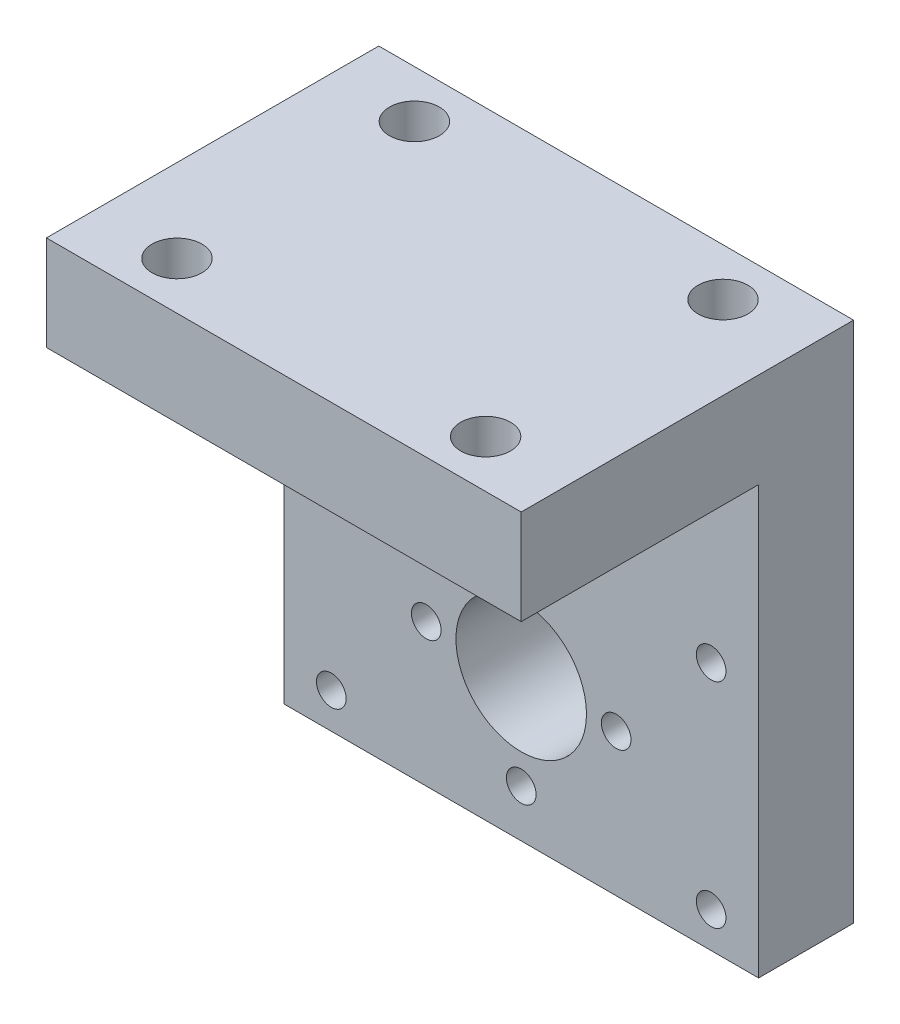
ISO-10303-21;
HEADER;
FILE_DESCRIPTION(('STEP AP214'),'2;1');
FILE_NAME('part.step','',(''),(''),'','','');
FILE_SCHEMA(('AUTOMOTIVE_DESIGN { 1 0 10303 214 1 1 1 1 }'));
ENDSEC;
DATA;
#1=APPLICATION_CONTEXT('core data for automotive mechanical design processes');
#2=APPLICATION_PROTOCOL_DEFINITION('international standard','automotive_design',2000,#1);
#3=PRODUCT_CONTEXT('',#1,'mechanical');
#4=PRODUCT('Part','Part','',(#3));
#5=PRODUCT_RELATED_PRODUCT_CATEGORY('part','',(#4));
#6=PRODUCT_DEFINITION_FORMATION('','',#4);
#7=PRODUCT_DEFINITION_CONTEXT('part definition',#1,'design');
#8=PRODUCT_DEFINITION('design','',#6,#7);
#9=PRODUCT_DEFINITION_SHAPE('','',#8);
#10=(LENGTH_UNIT() NAMED_UNIT(*) SI_UNIT(.MILLI.,.METRE.));
#11=(NAMED_UNIT(*) PLANE_ANGLE_UNIT() SI_UNIT($,.RADIAN.));
#12=(NAMED_UNIT(*) SI_UNIT($,.STERADIAN.) SOLID_ANGLE_UNIT());
#13=UNCERTAINTY_MEASURE_WITH_UNIT(LENGTH_MEASURE(1.E-05),#10,'distance_accuracy_value','');
#14=(GEOMETRIC_REPRESENTATION_CONTEXT(3) GLOBAL_UNCERTAINTY_ASSIGNED_CONTEXT((#13)) GLOBAL_UNIT_ASSIGNED_CONTEXT((#10,
#11,#12)) REPRESENTATION_CONTEXT('',''));
#15=CARTESIAN_POINT('',(0.,0.,0.));
#16=DIRECTION('',(0.,0.,1.));
#17=DIRECTION('',(1.,0.,0.));
#18=AXIS2_PLACEMENT_3D('',#15,#16,#17);
#19=CARTESIAN_POINT('',(13.,21.,4.));
#20=DIRECTION('',(0.,1.,0.));
#21=DIRECTION('',(1.,0.,0.));
#22=AXIS2_PLACEMENT_3D('',#19,#20,#21);
#23=PLANE('',#22);
#24=CARTESIAN_POINT('',(13.,21.,4.));
#25=DIRECTION('',(0.,1.,0.));
#26=DIRECTION('',(0.,0.,1.));
#27=AXIS2_PLACEMENT_3D('',#24,#25,#26);
#28=CIRCLE('',#27,2.1);
#29=CARTESIAN_POINT('',(13.,21.,6.1));
#30=VERTEX_POINT('',#29);
#31=EDGE_CURVE('E10',#30,#30,#28,.T.);
#32=ORIENTED_EDGE('',*,*,#31,.T.);
#33=EDGE_LOOP('',(#32));
#34=FACE_BOUND('',#33,.T.);
#35=ADVANCED_FACE('F16',(#34),#23,.T.);
#36=CARTESIAN_POINT('',(-13.,21.,4.));
#37=DIRECTION('',(0.,1.,0.));
#38=DIRECTION('',(1.,0.,0.));
#39=AXIS2_PLACEMENT_3D('',#36,#37,#38);
#40=PLANE('',#39);
#41=CARTESIAN_POINT('',(-13.,21.,4.));
#42=DIRECTION('',(0.,1.,0.));
#43=DIRECTION('',(0.,0.,1.));
#44=AXIS2_PLACEMENT_3D('',#41,#42,#43);
#45=CIRCLE('',#44,2.1);
#46=CARTESIAN_POINT('',(-13.,21.,6.1));
#47=VERTEX_POINT('',#46);
#48=EDGE_CURVE('E25',#47,#47,#45,.T.);
#49=ORIENTED_EDGE('',*,*,#48,.T.);
#50=EDGE_LOOP('',(#49));
#51=FACE_BOUND('',#50,.T.);
#52=ADVANCED_FACE('F291',(#51),#40,.T.);
#53=CARTESIAN_POINT('',(13.,21.,24.));
#54=DIRECTION('',(0.,1.,0.));
#55=DIRECTION('',(0.,0.,1.));
#56=AXIS2_PLACEMENT_3D('',#53,#54,#55);
#57=CYLINDRICAL_SURFACE('',#56,2.1);
#58=CARTESIAN_POINT('',(13.,32.,24.));
#59=DIRECTION('',(0.,1.,0.));
#60=DIRECTION('',(0.,0.,1.));
#61=AXIS2_PLACEMENT_3D('',#58,#59,#60);
#62=CIRCLE('',#61,2.1);
#63=CARTESIAN_POINT('',(13.,32.,26.1));
#64=VERTEX_POINT('',#63);
#65=EDGE_CURVE('E236',#64,#64,#62,.T.);
#66=ORIENTED_EDGE('',*,*,#65,.T.);
#67=EDGE_LOOP('',(#66));
#68=FACE_BOUND('',#67,.T.);
#69=CARTESIAN_POINT('',(13.,24.,24.));
#70=DIRECTION('',(0.,1.,0.));
#71=DIRECTION('',(0.,0.,1.));
#72=AXIS2_PLACEMENT_3D('',#69,#70,#71);
#73=CIRCLE('',#72,2.1);
#74=CARTESIAN_POINT('',(13.,24.,26.1));
#75=VERTEX_POINT('',#74);
#76=EDGE_CURVE('E124',#75,#75,#73,.T.);
#77=ORIENTED_EDGE('',*,*,#76,.F.);
#78=EDGE_LOOP('',(#77));
#79=FACE_BOUND('',#78,.T.);
#80=ADVANCED_FACE('F296',(#68,#79),#57,.F.);
#81=CARTESIAN_POINT('',(13.,21.,4.));
#82=DIRECTION('',(0.,1.,0.));
#83=DIRECTION('',(0.,0.,1.));
#84=AXIS2_PLACEMENT_3D('',#81,#82,#83);
#85=CYLINDRICAL_SURFACE('',#84,2.1);
#86=CARTESIAN_POINT('',(13.,32.,4.));
#87=DIRECTION('',(0.,1.,0.));
#88=DIRECTION('',(0.,0.,1.));
#89=AXIS2_PLACEMENT_3D('',#86,#87,#88);
#90=CIRCLE('',#89,2.1);
#91=CARTESIAN_POINT('',(13.,32.,6.1));
#92=VERTEX_POINT('',#91);
#93=EDGE_CURVE('E232',#92,#92,#90,.T.);
#94=ORIENTED_EDGE('',*,*,#93,.T.);
#95=EDGE_LOOP('',(#94));
#96=FACE_BOUND('',#95,.T.);
#97=ORIENTED_EDGE('',*,*,#31,.F.);
#98=EDGE_LOOP('',(#97));
#99=FACE_BOUND('',#98,.T.);
#100=ADVANCED_FACE('F301',(#96,#99),#85,.F.);
#101=CARTESIAN_POINT('',(-13.,21.,24.));
#102=DIRECTION('',(0.,1.,0.));
#103=DIRECTION('',(0.,0.,1.));
#104=AXIS2_PLACEMENT_3D('',#101,#102,#103);
#105=CYLINDRICAL_SURFACE('',#104,2.1);
#106=CARTESIAN_POINT('',(-13.,32.,24.));
#107=DIRECTION('',(0.,1.,0.));
#108=DIRECTION('',(0.,0.,1.));
#109=AXIS2_PLACEMENT_3D('',#106,#107,#108);
#110=CIRCLE('',#109,2.1);
#111=CARTESIAN_POINT('',(-13.,32.,26.1));
#112=VERTEX_POINT('',#111);
#113=EDGE_CURVE('E228',#112,#112,#110,.T.);
#114=ORIENTED_EDGE('',*,*,#113,.T.);
#115=EDGE_LOOP('',(#114));
#116=FACE_BOUND('',#115,.T.);
#117=CARTESIAN_POINT('',(-13.,24.,24.));
#118=DIRECTION('',(0.,1.,0.));
#119=DIRECTION('',(0.,0.,1.));
#120=AXIS2_PLACEMENT_3D('',#117,#118,#119);
#121=CIRCLE('',#120,2.1);
#122=CARTESIAN_POINT('',(-13.,24.,26.1));
#123=VERTEX_POINT('',#122);
#124=EDGE_CURVE('E128',#123,#123,#121,.T.);
#125=ORIENTED_EDGE('',*,*,#124,.F.);
#126=EDGE_LOOP('',(#125));
#127=FACE_BOUND('',#126,.T.);
#128=ADVANCED_FACE('F303',(#116,#127),#105,.F.);
#129=CARTESIAN_POINT('',(-13.,21.,4.));
#130=DIRECTION('',(0.,1.,0.));
#131=DIRECTION('',(0.,0.,1.));
#132=AXIS2_PLACEMENT_3D('',#129,#130,#131);
#133=CYLINDRICAL_SURFACE('',#132,2.1);
#134=CARTESIAN_POINT('',(-13.,32.,4.));
#135=DIRECTION('',(0.,1.,0.));
#136=DIRECTION('',(0.,0.,1.));
#137=AXIS2_PLACEMENT_3D('',#134,#135,#136);
#138=CIRCLE('',#137,2.1);
#139=CARTESIAN_POINT('',(-13.,32.,6.1));
#140=VERTEX_POINT('',#139);
#141=EDGE_CURVE('E224',#140,#140,#138,.T.);
#142=ORIENTED_EDGE('',*,*,#141,.T.);
#143=EDGE_LOOP('',(#142));
#144=FACE_BOUND('',#143,.T.);
#145=ORIENTED_EDGE('',*,*,#48,.F.);
#146=EDGE_LOOP('',(#145));
#147=FACE_BOUND('',#146,.T.);
#148=ADVANCED_FACE('F310',(#144,#147),#133,.F.);
#149=CARTESIAN_POINT('',(16.,9.,-1.));
#150=DIRECTION('',(0.,0.,1.));
#151=DIRECTION('',(1.,0.,0.));
#152=AXIS2_PLACEMENT_3D('',#149,#150,#151);
#153=CYLINDRICAL_SURFACE('',#152,1.25);
#154=CARTESIAN_POINT('',(16.,9.,8.));
#155=DIRECTION('',(0.,0.,1.));
#156=DIRECTION('',(1.,0.,0.));
#157=AXIS2_PLACEMENT_3D('',#154,#155,#156);
#158=CIRCLE('',#157,1.25);
#159=CARTESIAN_POINT('',(17.25,9.,8.));
#160=VERTEX_POINT('',#159);
#161=EDGE_CURVE('E173',#160,#160,#158,.T.);
#162=ORIENTED_EDGE('',*,*,#161,.T.);
#163=EDGE_LOOP('',(#162));
#164=FACE_BOUND('',#163,.T.);
#165=CARTESIAN_POINT('',(16.,9.,0.));
#166=DIRECTION('',(0.,0.,1.));
#167=DIRECTION('',(1.,0.,0.));
#168=AXIS2_PLACEMENT_3D('',#165,#166,#167);
#169=CIRCLE('',#168,1.25);
#170=CARTESIAN_POINT('',(17.25,9.,0.));
#171=VERTEX_POINT('',#170);
#172=EDGE_CURVE('E93',#171,#171,#169,.T.);
#173=ORIENTED_EDGE('',*,*,#172,.F.);
#174=EDGE_LOOP('',(#173));
#175=FACE_BOUND('',#174,.T.);
#176=ADVANCED_FACE('F317',(#164,#175),#153,.F.);
#177=CARTESIAN_POINT('',(0.,8.,-1.));
#178=DIRECTION('',(0.,0.,1.));
#179=DIRECTION('',(1.,0.,0.));
#180=AXIS2_PLACEMENT_3D('',#177,#178,#179);
#181=CYLINDRICAL_SURFACE('',#180,1.25);
#182=CARTESIAN_POINT('',(0.,8.,8.));
#183=DIRECTION('',(0.,0.,1.));
#184=DIRECTION('',(1.,0.,0.));
#185=AXIS2_PLACEMENT_3D('',#182,#183,#184);
#186=CIRCLE('',#185,1.25);
#187=CARTESIAN_POINT('',(1.25,8.,8.));
#188=VERTEX_POINT('',#187);
#189=EDGE_CURVE('E153',#188,#188,#186,.T.);
#190=ORIENTED_EDGE('',*,*,#189,.T.);
#191=EDGE_LOOP('',(#190));
#192=FACE_BOUND('',#191,.T.);
#193=CARTESIAN_POINT('',(0.,8.,0.));
#194=DIRECTION('',(0.,0.,1.));
#195=DIRECTION('',(1.,0.,0.));
#196=AXIS2_PLACEMENT_3D('',#193,#194,#195);
#197=CIRCLE('',#196,1.25);
#198=CARTESIAN_POINT('',(1.25,8.,0.));
#199=VERTEX_POINT('',#198);
#200=EDGE_CURVE('E165',#199,#199,#197,.T.);
#201=ORIENTED_EDGE('',*,*,#200,.F.);
#202=EDGE_LOOP('',(#201));
#203=FACE_BOUND('',#202,.T.);
#204=ADVANCED_FACE('F321',(#192,#203),#181,.F.);
#205=CARTESIAN_POINT('',(8.,0.,-1.));
#206=DIRECTION('',(0.,0.,1.));
#207=DIRECTION('',(1.,0.,0.));
#208=AXIS2_PLACEMENT_3D('',#205,#206,#207);
#209=CYLINDRICAL_SURFACE('',#208,1.25);
#210=CARTESIAN_POINT('',(8.,0.,8.));
#211=DIRECTION('',(0.,0.,1.));
#212=DIRECTION('',(1.,0.,0.));
#213=AXIS2_PLACEMENT_3D('',#210,#211,#212);
#214=CIRCLE('',#213,1.25);
#215=CARTESIAN_POINT('',(9.25,0.,8.));
#216=VERTEX_POINT('',#215);
#217=EDGE_CURVE('E149',#216,#216,#214,.T.);
#218=ORIENTED_EDGE('',*,*,#217,.T.);
#219=EDGE_LOOP('',(#218));
#220=FACE_BOUND('',#219,.T.);
#221=CARTESIAN_POINT('',(8.,0.,0.));
#222=DIRECTION('',(0.,0.,1.));
#223=DIRECTION('',(1.,0.,0.));
#224=AXIS2_PLACEMENT_3D('',#221,#222,#223);
#225=CIRCLE('',#224,1.25);
#226=CARTESIAN_POINT('',(9.25,0.,0.));
#227=VERTEX_POINT('',#226);
#228=EDGE_CURVE('E169',#227,#227,#225,.T.);
#229=ORIENTED_EDGE('',*,*,#228,.F.);
#230=EDGE_LOOP('',(#229));
#231=FACE_BOUND('',#230,.T.);
#232=ADVANCED_FACE('F362',(#220,#231),#209,.F.);
#233=CARTESIAN_POINT('',(0.,0.,-1.));
#234=DIRECTION('',(0.,0.,1.));
#235=DIRECTION('',(1.,0.,0.));
#236=AXIS2_PLACEMENT_3D('',#233,#234,#235);
#237=CYLINDRICAL_SURFACE('',#236,5.5);
#238=CARTESIAN_POINT('',(0.,0.,8.));
#239=DIRECTION('',(0.,0.,1.));
#240=DIRECTION('',(1.,0.,0.));
#241=AXIS2_PLACEMENT_3D('',#238,#239,#240);
#242=CIRCLE('',#241,5.5);
#243=CARTESIAN_POINT('',(5.5,0.,8.));
#244=VERTEX_POINT('',#243);
#245=EDGE_CURVE('E154',#244,#244,#242,.T.);
#246=ORIENTED_EDGE('',*,*,#245,.T.);
#247=EDGE_LOOP('',(#246));
#248=FACE_BOUND('',#247,.T.);
#249=CARTESIAN_POINT('',(0.,0.,0.));
#250=DIRECTION('',(0.,0.,1.));
#251=DIRECTION('',(1.,0.,0.));
#252=AXIS2_PLACEMENT_3D('',#249,#250,#251);
#253=CIRCLE('',#252,5.5);
#254=CARTESIAN_POINT('',(5.5,0.,0.));
#255=VERTEX_POINT('',#254);
#256=EDGE_CURVE('E212',#255,#255,#253,.T.);
#257=ORIENTED_EDGE('',*,*,#256,.F.);
#258=EDGE_LOOP('',(#257));
#259=FACE_BOUND('',#258,.T.);
#260=ADVANCED_FACE('F327',(#248,#259),#237,.F.);
#261=CARTESIAN_POINT('',(-16.,9.,-1.));
#262=DIRECTION('',(0.,0.,1.));
#263=DIRECTION('',(1.,0.,0.));
#264=AXIS2_PLACEMENT_3D('',#261,#262,#263);
#265=CYLINDRICAL_SURFACE('',#264,1.25);
#266=CARTESIAN_POINT('',(-16.,9.,8.));
#267=DIRECTION('',(0.,0.,1.));
#268=DIRECTION('',(1.,0.,0.));
#269=AXIS2_PLACEMENT_3D('',#266,#267,#268);
#270=CIRCLE('',#269,1.25);
#271=CARTESIAN_POINT('',(-14.75,9.,8.));
#272=VERTEX_POINT('',#271);
#273=EDGE_CURVE('E140',#272,#272,#270,.T.);
#274=ORIENTED_EDGE('',*,*,#273,.T.);
#275=EDGE_LOOP('',(#274));
#276=FACE_BOUND('',#275,.T.);
#277=CARTESIAN_POINT('',(-16.,9.,0.));
#278=DIRECTION('',(0.,0.,1.));
#279=DIRECTION('',(1.,0.,0.));
#280=AXIS2_PLACEMENT_3D('',#277,#278,#279);
#281=CIRCLE('',#280,1.25);
#282=CARTESIAN_POINT('',(-14.75,9.,0.));
#283=VERTEX_POINT('',#282);
#284=EDGE_CURVE('E208',#283,#283,#281,.T.);
#285=ORIENTED_EDGE('',*,*,#284,.F.);
#286=EDGE_LOOP('',(#285));
#287=FACE_BOUND('',#286,.T.);
#288=ADVANCED_FACE('F323',(#276,#287),#265,.F.);
#289=CARTESIAN_POINT('',(-8.,0.,-1.));
#290=DIRECTION('',(0.,0.,1.));
#291=DIRECTION('',(1.,0.,0.));
#292=AXIS2_PLACEMENT_3D('',#289,#290,#291);
#293=CYLINDRICAL_SURFACE('',#292,1.25);
#294=CARTESIAN_POINT('',(-8.,0.,8.));
#295=DIRECTION('',(0.,0.,1.));
#296=DIRECTION('',(1.,0.,0.));
#297=AXIS2_PLACEMENT_3D('',#294,#295,#296);
#298=CIRCLE('',#297,1.25);
#299=CARTESIAN_POINT('',(-6.75,0.,8.));
#300=VERTEX_POINT('',#299);
#301=EDGE_CURVE('E136',#300,#300,#298,.T.);
#302=ORIENTED_EDGE('',*,*,#301,.T.);
#303=EDGE_LOOP('',(#302));
#304=FACE_BOUND('',#303,.T.);
#305=CARTESIAN_POINT('',(-8.,0.,0.));
#306=DIRECTION('',(0.,0.,1.));
#307=DIRECTION('',(1.,0.,0.));
#308=AXIS2_PLACEMENT_3D('',#305,#306,#307);
#309=CIRCLE('',#308,1.25);
#310=CARTESIAN_POINT('',(-6.75,0.,0.));
#311=VERTEX_POINT('',#310);
#312=EDGE_CURVE('E204',#311,#311,#309,.T.);
#313=ORIENTED_EDGE('',*,*,#312,.F.);
#314=EDGE_LOOP('',(#313));
#315=FACE_BOUND('',#314,.T.);
#316=ADVANCED_FACE('F326',(#304,#315),#293,.F.);
#317=CARTESIAN_POINT('',(16.,-9.,-1.));
#318=DIRECTION('',(0.,0.,1.));
#319=DIRECTION('',(1.,0.,0.));
#320=AXIS2_PLACEMENT_3D('',#317,#318,#319);
#321=CYLINDRICAL_SURFACE('',#320,1.25);
#322=CARTESIAN_POINT('',(16.,-9.,8.));
#323=DIRECTION('',(0.,0.,1.));
#324=DIRECTION('',(1.,0.,0.));
#325=AXIS2_PLACEMENT_3D('',#322,#323,#324);
#326=CIRCLE('',#325,1.25);
#327=CARTESIAN_POINT('',(17.25,-9.,8.));
#328=VERTEX_POINT('',#327);
#329=EDGE_CURVE('E141',#328,#328,#326,.T.);
#330=ORIENTED_EDGE('',*,*,#329,.T.);
#331=EDGE_LOOP('',(#330));
#332=FACE_BOUND('',#331,.T.);
#333=CARTESIAN_POINT('',(16.,-9.,0.));
#334=DIRECTION('',(0.,0.,1.));
#335=DIRECTION('',(1.,0.,0.));
#336=AXIS2_PLACEMENT_3D('',#333,#334,#335);
#337=CIRCLE('',#336,1.25);
#338=CARTESIAN_POINT('',(17.25,-9.,0.));
#339=VERTEX_POINT('',#338);
#340=EDGE_CURVE('E200',#339,#339,#337,.T.);
#341=ORIENTED_EDGE('',*,*,#340,.F.);
#342=EDGE_LOOP('',(#341));
#343=FACE_BOUND('',#342,.T.);
#344=ADVANCED_FACE('F329',(#332,#343),#321,.F.);
#345=CARTESIAN_POINT('',(0.,-8.,-1.));
#346=DIRECTION('',(0.,0.,1.));
#347=DIRECTION('',(1.,0.,0.));
#348=AXIS2_PLACEMENT_3D('',#345,#346,#347);
#349=CYLINDRICAL_SURFACE('',#348,1.25);
#350=CARTESIAN_POINT('',(0.,-8.,8.));
#351=DIRECTION('',(0.,0.,1.));
#352=DIRECTION('',(1.,0.,0.));
#353=AXIS2_PLACEMENT_3D('',#350,#351,#352);
#354=CIRCLE('',#353,1.25);
#355=CARTESIAN_POINT('',(1.25,-8.,8.));
#356=VERTEX_POINT('',#355);
#357=EDGE_CURVE('E155',#356,#356,#354,.T.);
#358=ORIENTED_EDGE('',*,*,#357,.T.);
#359=EDGE_LOOP('',(#358));
#360=FACE_BOUND('',#359,.T.);
#361=CARTESIAN_POINT('',(0.,-8.,0.));
#362=DIRECTION('',(0.,0.,1.));
#363=DIRECTION('',(1.,0.,0.));
#364=AXIS2_PLACEMENT_3D('',#361,#362,#363);
#365=CIRCLE('',#364,1.25);
#366=CARTESIAN_POINT('',(1.25,-8.,0.));
#367=VERTEX_POINT('',#366);
#368=EDGE_CURVE('E196',#367,#367,#365,.T.);
#369=ORIENTED_EDGE('',*,*,#368,.F.);
#370=EDGE_LOOP('',(#369));
#371=FACE_BOUND('',#370,.T.);
#372=ADVANCED_FACE('F331',(#360,#371),#349,.F.);
#373=CARTESIAN_POINT('',(-16.,-9.,-1.));
#374=DIRECTION('',(0.,0.,1.));
#375=DIRECTION('',(1.,0.,0.));
#376=AXIS2_PLACEMENT_3D('',#373,#374,#375);
#377=CYLINDRICAL_SURFACE('',#376,1.25);
#378=CARTESIAN_POINT('',(-16.,-9.,8.));
#379=DIRECTION('',(0.,0.,1.));
#380=DIRECTION('',(1.,0.,0.));
#381=AXIS2_PLACEMENT_3D('',#378,#379,#380);
#382=CIRCLE('',#381,1.25);
#383=CARTESIAN_POINT('',(-14.75,-9.,8.));
#384=VERTEX_POINT('',#383);
#385=EDGE_CURVE('E148',#384,#384,#382,.T.);
#386=ORIENTED_EDGE('',*,*,#385,.T.);
#387=EDGE_LOOP('',(#386));
#388=FACE_BOUND('',#387,.T.);
#389=CARTESIAN_POINT('',(-16.,-9.,0.));
#390=DIRECTION('',(0.,0.,1.));
#391=DIRECTION('',(1.,0.,0.));
#392=AXIS2_PLACEMENT_3D('',#389,#390,#391);
#393=CIRCLE('',#392,1.25);
#394=CARTESIAN_POINT('',(-14.75,-9.,0.));
#395=VERTEX_POINT('',#394);
#396=EDGE_CURVE('E192',#395,#395,#393,.T.);
#397=ORIENTED_EDGE('',*,*,#396,.F.);
#398=EDGE_LOOP('',(#397));
#399=FACE_BOUND('',#398,.T.);
#400=ADVANCED_FACE('F260',(#388,#399),#377,.F.);
#401=CARTESIAN_POINT('',(20.,-12.,0.));
#402=DIRECTION('',(1.,0.,0.));
#403=DIRECTION('',(0.,1.,0.));
#404=AXIS2_PLACEMENT_3D('',#401,#402,#403);
#405=PLANE('',#404);
#406=DIRECTION('',(0.,1.,0.));
#407=VECTOR('',#406,1.);
#408=CARTESIAN_POINT('',(20.,-12.,8.));
#409=LINE('',#408,#407);
#410=CARTESIAN_POINT('',(20.,-12.,8.));
#411=VERTEX_POINT('',#410);
#412=CARTESIAN_POINT('',(20.,24.,8.));
#413=VERTEX_POINT('',#412);
#414=EDGE_CURVE('E135',#411,#413,#409,.T.);
#415=ORIENTED_EDGE('',*,*,#414,.F.);
#416=DIRECTION('',(0.,0.,1.));
#417=VECTOR('',#416,1.);
#418=CARTESIAN_POINT('',(20.,-12.,0.));
#419=LINE('',#418,#417);
#420=CARTESIAN_POINT('',(20.,-12.,0.));
#421=VERTEX_POINT('',#420);
#422=EDGE_CURVE('E177',#421,#411,#419,.T.);
#423=ORIENTED_EDGE('',*,*,#422,.F.);
#424=DIRECTION('',(0.,-1.,0.));
#425=VECTOR('',#424,1.);
#426=CARTESIAN_POINT('',(20.,32.,0.));
#427=LINE('',#426,#425);
#428=CARTESIAN_POINT('',(20.,32.,0.));
#429=VERTEX_POINT('',#428);
#430=EDGE_CURVE('E189',#429,#421,#427,.T.);
#431=ORIENTED_EDGE('',*,*,#430,.F.);
#432=DIRECTION('',(0.,0.,1.));
#433=VECTOR('',#432,1.);
#434=CARTESIAN_POINT('',(20.,32.,0.));
#435=LINE('',#434,#433);
#436=CARTESIAN_POINT('',(20.,32.,28.));
#437=VERTEX_POINT('',#436);
#438=EDGE_CURVE('E92',#429,#437,#435,.T.);
#439=ORIENTED_EDGE('',*,*,#438,.T.);
#440=DIRECTION('',(0.,1.,0.));
#441=VECTOR('',#440,1.);
#442=CARTESIAN_POINT('',(20.,24.,28.));
#443=LINE('',#442,#441);
#444=CARTESIAN_POINT('',(20.,24.,28.));
#445=VERTEX_POINT('',#444);
#446=EDGE_CURVE('E88',#445,#437,#443,.T.);
#447=ORIENTED_EDGE('',*,*,#446,.F.);
#448=DIRECTION('',(0.,0.,1.));
#449=VECTOR('',#448,1.);
#450=CARTESIAN_POINT('',(20.,24.,0.));
#451=LINE('',#450,#449);
#452=EDGE_CURVE('E36',#413,#445,#451,.T.);
#453=ORIENTED_EDGE('',*,*,#452,.F.);
#454=EDGE_LOOP('',(#415,#423,#431,#439,#447,#453));
#455=FACE_BOUND('',#454,.T.);
#456=ADVANCED_FACE('F276',(#455),#405,.T.);
#457=CARTESIAN_POINT('',(-20.,24.,0.));
#458=DIRECTION('',(0.,1.,0.));
#459=DIRECTION('',(1.,0.,0.));
#460=AXIS2_PLACEMENT_3D('',#457,#458,#459);
#461=PLANE('',#460);
#462=ORIENTED_EDGE('',*,*,#76,.T.);
#463=EDGE_LOOP('',(#462));
#464=FACE_BOUND('',#463,.T.);
#465=ORIENTED_EDGE('',*,*,#124,.T.);
#466=EDGE_LOOP('',(#465));
#467=FACE_BOUND('',#466,.T.);
#468=DIRECTION('',(1.,0.,0.));
#469=VECTOR('',#468,1.);
#470=CARTESIAN_POINT('',(-20.,24.,28.));
#471=LINE('',#470,#469);
#472=CARTESIAN_POINT('',(-20.,24.,28.));
#473=VERTEX_POINT('',#472);
#474=EDGE_CURVE('E240',#473,#445,#471,.T.);
#475=ORIENTED_EDGE('',*,*,#474,.F.);
#476=DIRECTION('',(0.,0.,1.));
#477=VECTOR('',#476,1.);
#478=CARTESIAN_POINT('',(-20.,24.,0.));
#479=LINE('',#478,#477);
#480=CARTESIAN_POINT('',(-20.,24.,8.));
#481=VERTEX_POINT('',#480);
#482=EDGE_CURVE('E109',#481,#473,#479,.T.);
#483=ORIENTED_EDGE('',*,*,#482,.F.);
#484=DIRECTION('',(-1.,0.,0.));
#485=VECTOR('',#484,1.);
#486=CARTESIAN_POINT('',(-20.,24.,8.));
#487=LINE('',#486,#485);
#488=EDGE_CURVE('E145',#413,#481,#487,.T.);
#489=ORIENTED_EDGE('',*,*,#488,.F.);
#490=ORIENTED_EDGE('',*,*,#452,.T.);
#491=EDGE_LOOP('',(#475,#483,#489,#490));
#492=FACE_BOUND('',#491,.T.);
#493=ADVANCED_FACE('F277',(#464,#467,#492),#461,.F.);
#494=CARTESIAN_POINT('',(-20.,24.,28.));
#495=DIRECTION('',(0.,0.,1.));
#496=DIRECTION('',(1.,0.,0.));
#497=AXIS2_PLACEMENT_3D('',#494,#495,#496);
#498=PLANE('',#497);
#499=DIRECTION('',(0.,1.,0.));
#500=VECTOR('',#499,1.);
#501=CARTESIAN_POINT('',(-20.,24.,28.));
#502=LINE('',#501,#500);
#503=CARTESIAN_POINT('',(-20.,32.,28.));
#504=VERTEX_POINT('',#503);
#505=EDGE_CURVE('E86',#473,#504,#502,.T.);
#506=ORIENTED_EDGE('',*,*,#505,.F.);
#507=ORIENTED_EDGE('',*,*,#474,.T.);
#508=ORIENTED_EDGE('',*,*,#446,.T.);
#509=DIRECTION('',(1.,0.,0.));
#510=VECTOR('',#509,1.);
#511=CARTESIAN_POINT('',(-20.,32.,28.));
#512=LINE('',#511,#510);
#513=EDGE_CURVE('E81',#504,#437,#512,.T.);
#514=ORIENTED_EDGE('',*,*,#513,.F.);
#515=EDGE_LOOP('',(#506,#507,#508,#514));
#516=FACE_BOUND('',#515,.T.);
#517=ADVANCED_FACE('F83',(#516),#498,.T.);
#518=CARTESIAN_POINT('',(-20.,32.,0.));
#519=DIRECTION('',(0.,1.,0.));
#520=DIRECTION('',(1.,0.,0.));
#521=AXIS2_PLACEMENT_3D('',#518,#519,#520);
#522=PLANE('',#521);
#523=ORIENTED_EDGE('',*,*,#65,.F.);
#524=EDGE_LOOP('',(#523));
#525=FACE_BOUND('',#524,.T.);
#526=ORIENTED_EDGE('',*,*,#93,.F.);
#527=EDGE_LOOP('',(#526));
#528=FACE_BOUND('',#527,.T.);
#529=ORIENTED_EDGE('',*,*,#113,.F.);
#530=EDGE_LOOP('',(#529));
#531=FACE_BOUND('',#530,.T.);
#532=ORIENTED_EDGE('',*,*,#141,.F.);
#533=EDGE_LOOP('',(#532));
#534=FACE_BOUND('',#533,.T.);
#535=DIRECTION('',(1.,0.,0.));
#536=VECTOR('',#535,1.);
#537=CARTESIAN_POINT('',(-20.,32.,0.));
#538=LINE('',#537,#536);
#539=CARTESIAN_POINT('',(-20.,32.,0.));
#540=VERTEX_POINT('',#539);
#541=EDGE_CURVE('E99',#540,#429,#538,.T.);
#542=ORIENTED_EDGE('',*,*,#541,.F.);
#543=DIRECTION('',(0.,0.,-1.));
#544=VECTOR('',#543,1.);
#545=CARTESIAN_POINT('',(-20.,32.,28.));
#546=LINE('',#545,#544);
#547=EDGE_CURVE('E96',#504,#540,#546,.T.);
#548=ORIENTED_EDGE('',*,*,#547,.F.);
#549=ORIENTED_EDGE('',*,*,#513,.T.);
#550=ORIENTED_EDGE('',*,*,#438,.F.);
#551=EDGE_LOOP('',(#542,#548,#549,#550));
#552=FACE_BOUND('',#551,.T.);
#553=ADVANCED_FACE('F97',(#525,#528,#531,#534,#552),#522,.T.);
#554=CARTESIAN_POINT('',(-20.,-12.,0.));
#555=DIRECTION('',(0.,0.,1.));
#556=DIRECTION('',(1.,0.,0.));
#557=AXIS2_PLACEMENT_3D('',#554,#555,#556);
#558=PLANE('',#557);
#559=ORIENTED_EDGE('',*,*,#172,.T.);
#560=EDGE_LOOP('',(#559));
#561=FACE_BOUND('',#560,.T.);
#562=ORIENTED_EDGE('',*,*,#200,.T.);
#563=EDGE_LOOP('',(#562));
#564=FACE_BOUND('',#563,.T.);
#565=ORIENTED_EDGE('',*,*,#228,.T.);
#566=EDGE_LOOP('',(#565));
#567=FACE_BOUND('',#566,.T.);
#568=ORIENTED_EDGE('',*,*,#256,.T.);
#569=EDGE_LOOP('',(#568));
#570=FACE_BOUND('',#569,.T.);
#571=ORIENTED_EDGE('',*,*,#284,.T.);
#572=EDGE_LOOP('',(#571));
#573=FACE_BOUND('',#572,.T.);
#574=ORIENTED_EDGE('',*,*,#312,.T.);
#575=EDGE_LOOP('',(#574));
#576=FACE_BOUND('',#575,.T.);
#577=ORIENTED_EDGE('',*,*,#340,.T.);
#578=EDGE_LOOP('',(#577));
#579=FACE_BOUND('',#578,.T.);
#580=ORIENTED_EDGE('',*,*,#368,.T.);
#581=EDGE_LOOP('',(#580));
#582=FACE_BOUND('',#581,.T.);
#583=ORIENTED_EDGE('',*,*,#396,.T.);
#584=EDGE_LOOP('',(#583));
#585=FACE_BOUND('',#584,.T.);
#586=DIRECTION('',(0.,-1.,0.));
#587=VECTOR('',#586,1.);
#588=CARTESIAN_POINT('',(-20.,32.,0.));
#589=LINE('',#588,#587);
#590=CARTESIAN_POINT('',(-20.,-12.,0.));
#591=VERTEX_POINT('',#590);
#592=EDGE_CURVE('E104',#540,#591,#589,.T.);
#593=ORIENTED_EDGE('',*,*,#592,.F.);
#594=ORIENTED_EDGE('',*,*,#541,.T.);
#595=ORIENTED_EDGE('',*,*,#430,.T.);
#596=DIRECTION('',(1.,0.,0.));
#597=VECTOR('',#596,1.);
#598=CARTESIAN_POINT('',(-20.,-12.,0.));
#599=LINE('',#598,#597);
#600=EDGE_CURVE('E183',#591,#421,#599,.T.);
#601=ORIENTED_EDGE('',*,*,#600,.F.);
#602=EDGE_LOOP('',(#593,#594,#595,#601));
#603=FACE_BOUND('',#602,.T.);
#604=ADVANCED_FACE('F341',(#561,#564,#567,#570,#573,#576,#579,#582,#585,#603),#558,.F.);
#605=CARTESIAN_POINT('',(-20.,-12.,0.));
#606=DIRECTION('',(0.,1.,0.));
#607=DIRECTION('',(1.,0.,0.));
#608=AXIS2_PLACEMENT_3D('',#605,#606,#607);
#609=PLANE('',#608);
#610=ORIENTED_EDGE('',*,*,#422,.T.);
#611=DIRECTION('',(1.,0.,0.));
#612=VECTOR('',#611,1.);
#613=CARTESIAN_POINT('',(-20.,-12.,8.));
#614=LINE('',#613,#612);
#615=CARTESIAN_POINT('',(-20.,-12.,8.));
#616=VERTEX_POINT('',#615);
#617=EDGE_CURVE('E131',#616,#411,#614,.T.);
#618=ORIENTED_EDGE('',*,*,#617,.F.);
#619=DIRECTION('',(0.,0.,1.));
#620=VECTOR('',#619,1.);
#621=CARTESIAN_POINT('',(-20.,-12.,0.));
#622=LINE('',#621,#620);
#623=EDGE_CURVE('E119',#591,#616,#622,.T.);
#624=ORIENTED_EDGE('',*,*,#623,.F.);
#625=ORIENTED_EDGE('',*,*,#600,.T.);
#626=EDGE_LOOP('',(#610,#618,#624,#625));
#627=FACE_BOUND('',#626,.T.);
#628=ADVANCED_FACE('F266',(#627),#609,.F.);
#629=CARTESIAN_POINT('',(-20.,-12.,8.));
#630=DIRECTION('',(0.,0.,1.));
#631=DIRECTION('',(1.,0.,0.));
#632=AXIS2_PLACEMENT_3D('',#629,#630,#631);
#633=PLANE('',#632);
#634=ORIENTED_EDGE('',*,*,#161,.F.);
#635=EDGE_LOOP('',(#634));
#636=FACE_BOUND('',#635,.T.);
#637=ORIENTED_EDGE('',*,*,#189,.F.);
#638=EDGE_LOOP('',(#637));
#639=FACE_BOUND('',#638,.T.);
#640=ORIENTED_EDGE('',*,*,#217,.F.);
#641=EDGE_LOOP('',(#640));
#642=FACE_BOUND('',#641,.T.);
#643=ORIENTED_EDGE('',*,*,#245,.F.);
#644=EDGE_LOOP('',(#643));
#645=FACE_BOUND('',#644,.T.);
#646=ORIENTED_EDGE('',*,*,#273,.F.);
#647=EDGE_LOOP('',(#646));
#648=FACE_BOUND('',#647,.T.);
#649=ORIENTED_EDGE('',*,*,#301,.F.);
#650=EDGE_LOOP('',(#649));
#651=FACE_BOUND('',#650,.T.);
#652=ORIENTED_EDGE('',*,*,#329,.F.);
#653=EDGE_LOOP('',(#652));
#654=FACE_BOUND('',#653,.T.);
#655=ORIENTED_EDGE('',*,*,#357,.F.);
#656=EDGE_LOOP('',(#655));
#657=FACE_BOUND('',#656,.T.);
#658=ORIENTED_EDGE('',*,*,#385,.F.);
#659=EDGE_LOOP('',(#658));
#660=FACE_BOUND('',#659,.T.);
#661=DIRECTION('',(0.,1.,0.));
#662=VECTOR('',#661,1.);
#663=CARTESIAN_POINT('',(-20.,-12.,8.));
#664=LINE('',#663,#662);
#665=EDGE_CURVE('E123',#616,#481,#664,.T.);
#666=ORIENTED_EDGE('',*,*,#665,.F.);
#667=ORIENTED_EDGE('',*,*,#617,.T.);
#668=ORIENTED_EDGE('',*,*,#414,.T.);
#669=ORIENTED_EDGE('',*,*,#488,.T.);
#670=EDGE_LOOP('',(#666,#667,#668,#669));
#671=FACE_BOUND('',#670,.T.);
#672=ADVANCED_FACE('F263',(#636,#639,#642,#645,#648,#651,#654,#657,#660,#671),#633,.T.);
#673=CARTESIAN_POINT('',(-20.,-12.,0.));
#674=DIRECTION('',(1.,0.,0.));
#675=DIRECTION('',(0.,1.,0.));
#676=AXIS2_PLACEMENT_3D('',#673,#674,#675);
#677=PLANE('',#676);
#678=ORIENTED_EDGE('',*,*,#482,.T.);
#679=ORIENTED_EDGE('',*,*,#505,.T.);
#680=ORIENTED_EDGE('',*,*,#547,.T.);
#681=ORIENTED_EDGE('',*,*,#592,.T.);
#682=ORIENTED_EDGE('',*,*,#623,.T.);
#683=ORIENTED_EDGE('',*,*,#665,.T.);
#684=EDGE_LOOP('',(#678,#679,#680,#681,#682,#683));
#685=FACE_BOUND('',#684,.T.);
#686=ADVANCED_FACE('F106',(#685),#677,.F.);
#687=CLOSED_SHELL('',(#35,#52,#80,#100,#128,#148,#176,#204,#232,#260,#288,#316,#344,#372,#400,
#456,#493,#517,#553,#604,#628,#672,#686));
#688=MANIFOLD_SOLID_BREP('B1',#687);
#689=ADVANCED_BREP_SHAPE_REPRESENTATION('',(#18,#688),#14);
#690=SHAPE_DEFINITION_REPRESENTATION(#9,#689);
ENDSEC;
END-ISO-10303-21;
